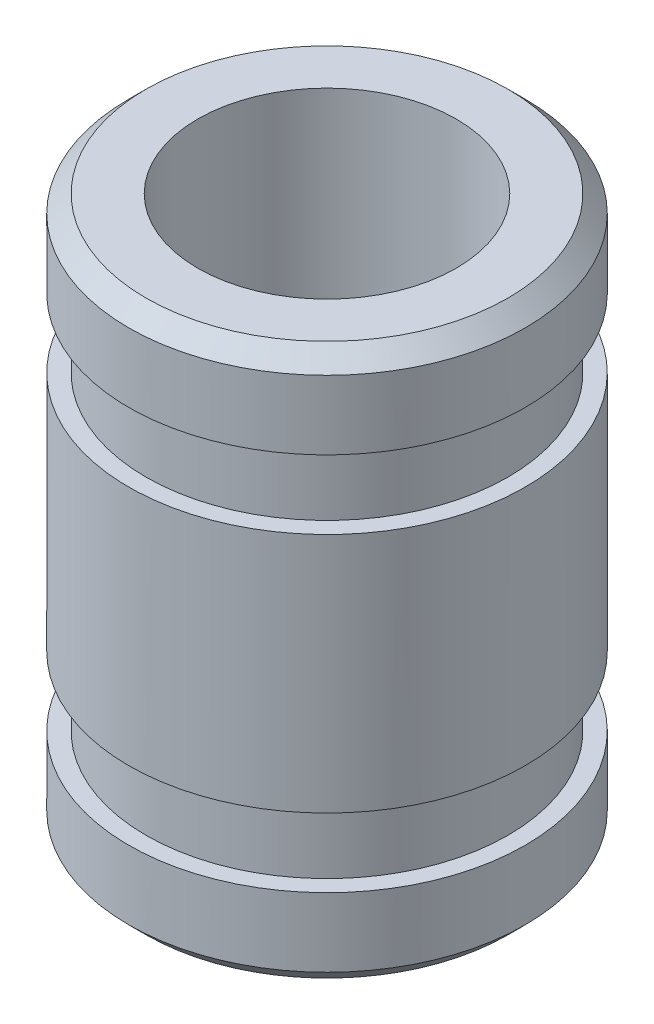
ISO-10303-21;
HEADER;
FILE_DESCRIPTION(('STEP AP214'),'2;1');
FILE_NAME('part.step','',(''),(''),'','','');
FILE_SCHEMA(('AUTOMOTIVE_DESIGN { 1 0 10303 214 1 1 1 1 }'));
ENDSEC;
DATA;
#1=APPLICATION_CONTEXT('core data for automotive mechanical design processes');
#2=APPLICATION_PROTOCOL_DEFINITION('international standard','automotive_design',2000,#1);
#3=PRODUCT_CONTEXT('',#1,'mechanical');
#4=PRODUCT('Part','Part','',(#3));
#5=PRODUCT_RELATED_PRODUCT_CATEGORY('part','',(#4));
#6=PRODUCT_DEFINITION_FORMATION('','',#4);
#7=PRODUCT_DEFINITION_CONTEXT('part definition',#1,'design');
#8=PRODUCT_DEFINITION('design','',#6,#7);
#9=PRODUCT_DEFINITION_SHAPE('','',#8);
#10=(LENGTH_UNIT() NAMED_UNIT(*) SI_UNIT(.MILLI.,.METRE.));
#11=(NAMED_UNIT(*) PLANE_ANGLE_UNIT() SI_UNIT($,.RADIAN.));
#12=(NAMED_UNIT(*) SI_UNIT($,.STERADIAN.) SOLID_ANGLE_UNIT());
#13=UNCERTAINTY_MEASURE_WITH_UNIT(LENGTH_MEASURE(1.E-05),#10,'distance_accuracy_value','');
#14=(GEOMETRIC_REPRESENTATION_CONTEXT(3) GLOBAL_UNCERTAINTY_ASSIGNED_CONTEXT((#13)) GLOBAL_UNIT_ASSIGNED_CONTEXT((#10,
#11,#12)) REPRESENTATION_CONTEXT('',''));
#15=CARTESIAN_POINT('',(0.,0.,0.));
#16=DIRECTION('',(0.,0.,1.));
#17=DIRECTION('',(1.,0.,0.));
#18=AXIS2_PLACEMENT_3D('',#15,#16,#17);
#19=CARTESIAN_POINT('',(0.,32.,0.));
#20=DIRECTION('',(0.,-1.,0.));
#21=DIRECTION('',(0.,0.,-1.));
#22=AXIS2_PLACEMENT_3D('',#19,#20,#21);
#23=CYLINDRICAL_SURFACE('',#22,11.5);
#24=CARTESIAN_POINT('',(0.,9.,0.));
#25=DIRECTION('',(0.,-1.,0.));
#26=DIRECTION('',(1.,0.,0.));
#27=AXIS2_PLACEMENT_3D('',#24,#25,#26);
#28=CIRCLE('',#27,11.5);
#29=CARTESIAN_POINT('',(11.5,9.,0.));
#30=VERTEX_POINT('',#29);
#31=EDGE_CURVE('E107',#30,#30,#28,.T.);
#32=ORIENTED_EDGE('',*,*,#31,.F.);
#33=EDGE_LOOP('',(#32));
#34=FACE_BOUND('',#33,.T.);
#35=CARTESIAN_POINT('',(0.,23.,0.));
#36=DIRECTION('',(0.,1.,0.));
#37=DIRECTION('',(0.,0.,-1.));
#38=AXIS2_PLACEMENT_3D('',#35,#36,#37);
#39=CIRCLE('',#38,11.5);
#40=CARTESIAN_POINT('',(0.,23.,-11.5000000000001));
#41=VERTEX_POINT('',#40);
#42=EDGE_CURVE('E49',#41,#41,#39,.T.);
#43=ORIENTED_EDGE('',*,*,#42,.F.);
#44=EDGE_LOOP('',(#43));
#45=FACE_BOUND('',#44,.T.);
#46=ADVANCED_FACE('F34',(#34,#45),#23,.T.);
#47=CARTESIAN_POINT('',(0.,31.,0.));
#48=DIRECTION('',(0.,1.,0.));
#49=DIRECTION('',(0.,0.,1.));
#50=AXIS2_PLACEMENT_3D('',#47,#48,#49);
#51=CIRCLE('',#50,11.5);
#52=CARTESIAN_POINT('',(0.,31.,11.5));
#53=VERTEX_POINT('',#52);
#54=EDGE_CURVE('E11',#53,#53,#51,.F.);
#55=ORIENTED_EDGE('',*,*,#54,.T.);
#56=EDGE_LOOP('',(#55));
#57=FACE_BOUND('',#56,.T.);
#58=CARTESIAN_POINT('',(0.,27.,0.));
#59=DIRECTION('',(0.,1.,0.));
#60=DIRECTION('',(0.,0.,-1.));
#61=AXIS2_PLACEMENT_3D('',#58,#59,#60);
#62=CIRCLE('',#61,11.5);
#63=CARTESIAN_POINT('',(0.,27.,-11.5000000000001));
#64=VERTEX_POINT('',#63);
#65=EDGE_CURVE('E91',#64,#64,#62,.T.);
#66=ORIENTED_EDGE('',*,*,#65,.T.);
#67=EDGE_LOOP('',(#66));
#68=FACE_BOUND('',#67,.T.);
#69=ADVANCED_FACE('F138',(#57,#68),#23,.T.);
#70=CARTESIAN_POINT('',(0.,1.,0.));
#71=DIRECTION('',(0.,1.,0.));
#72=DIRECTION('',(0.,0.,1.));
#73=AXIS2_PLACEMENT_3D('',#70,#71,#72);
#74=CIRCLE('',#73,11.5);
#75=CARTESIAN_POINT('',(0.,1.,11.5));
#76=VERTEX_POINT('',#75);
#77=EDGE_CURVE('E116',#76,#76,#74,.T.);
#78=ORIENTED_EDGE('',*,*,#77,.T.);
#79=EDGE_LOOP('',(#78));
#80=FACE_BOUND('',#79,.T.);
#81=CARTESIAN_POINT('',(0.,5.,0.));
#82=DIRECTION('',(0.,-1.,0.));
#83=DIRECTION('',(1.,0.,0.));
#84=AXIS2_PLACEMENT_3D('',#81,#82,#83);
#85=CIRCLE('',#84,11.5);
#86=CARTESIAN_POINT('',(11.5,5.,0.));
#87=VERTEX_POINT('',#86);
#88=EDGE_CURVE('E100',#87,#87,#85,.T.);
#89=ORIENTED_EDGE('',*,*,#88,.T.);
#90=EDGE_LOOP('',(#89));
#91=FACE_BOUND('',#90,.T.);
#92=ADVANCED_FACE('F141',(#80,#91),#23,.T.);
#93=CARTESIAN_POINT('',(0.,32.,0.));
#94=DIRECTION('',(0.,1.,0.));
#95=DIRECTION('',(0.,0.,1.));
#96=AXIS2_PLACEMENT_3D('',#93,#94,#95);
#97=PLANE('',#96);
#98=CARTESIAN_POINT('',(0.,32.,0.));
#99=DIRECTION('',(0.,1.,0.));
#100=DIRECTION('',(0.,0.,1.));
#101=AXIS2_PLACEMENT_3D('',#98,#99,#100);
#102=CIRCLE('',#101,10.5);
#103=CARTESIAN_POINT('',(0.,32.,10.5));
#104=VERTEX_POINT('',#103);
#105=EDGE_CURVE('E42',#104,#104,#102,.T.);
#106=ORIENTED_EDGE('',*,*,#105,.T.);
#107=EDGE_LOOP('',(#106));
#108=FACE_BOUND('',#107,.T.);
#109=CARTESIAN_POINT('',(0.,32.,0.));
#110=DIRECTION('',(0.,1.,0.));
#111=DIRECTION('',(0.,0.,1.));
#112=AXIS2_PLACEMENT_3D('',#109,#110,#111);
#113=CIRCLE('',#112,7.5);
#114=CARTESIAN_POINT('',(0.,32.,7.50000000000002));
#115=VERTEX_POINT('',#114);
#116=EDGE_CURVE('E110',#115,#115,#113,.T.);
#117=ORIENTED_EDGE('',*,*,#116,.F.);
#118=EDGE_LOOP('',(#117));
#119=FACE_BOUND('',#118,.T.);
#120=ADVANCED_FACE('F126',(#108,#119),#97,.T.);
#121=CARTESIAN_POINT('',(0.,0.,0.));
#122=DIRECTION('',(0.,1.,0.));
#123=DIRECTION('',(0.,0.,1.));
#124=AXIS2_PLACEMENT_3D('',#121,#122,#123);
#125=PLANE('',#124);
#126=CARTESIAN_POINT('',(0.,0.,0.));
#127=DIRECTION('',(0.,1.,0.));
#128=DIRECTION('',(0.,0.,1.));
#129=AXIS2_PLACEMENT_3D('',#126,#127,#128);
#130=CIRCLE('',#129,10.5);
#131=CARTESIAN_POINT('',(0.,0.,10.5));
#132=VERTEX_POINT('',#131);
#133=EDGE_CURVE('E121',#132,#132,#130,.F.);
#134=ORIENTED_EDGE('',*,*,#133,.T.);
#135=EDGE_LOOP('',(#134));
#136=FACE_BOUND('',#135,.T.);
#137=CARTESIAN_POINT('',(0.,0.,0.));
#138=DIRECTION('',(0.,1.,0.));
#139=DIRECTION('',(0.,0.,1.));
#140=AXIS2_PLACEMENT_3D('',#137,#138,#139);
#141=CIRCLE('',#140,7.5);
#142=CARTESIAN_POINT('',(0.,0.,7.50000000000002));
#143=VERTEX_POINT('',#142);
#144=EDGE_CURVE('E113',#143,#143,#141,.T.);
#145=ORIENTED_EDGE('',*,*,#144,.T.);
#146=EDGE_LOOP('',(#145));
#147=FACE_BOUND('',#146,.T.);
#148=ADVANCED_FACE('F154',(#136,#147),#125,.F.);
#149=CARTESIAN_POINT('',(0.,0.,0.));
#150=DIRECTION('',(0.,1.,0.));
#151=DIRECTION('',(0.,0.,1.));
#152=AXIS2_PLACEMENT_3D('',#149,#150,#151);
#153=CYLINDRICAL_SURFACE('',#152,7.5);
#154=ORIENTED_EDGE('',*,*,#144,.F.);
#155=EDGE_LOOP('',(#154));
#156=FACE_BOUND('',#155,.T.);
#157=ORIENTED_EDGE('',*,*,#116,.T.);
#158=EDGE_LOOP('',(#157));
#159=FACE_BOUND('',#158,.T.);
#160=ADVANCED_FACE('F170',(#156,#159),#153,.F.);
#161=CARTESIAN_POINT('',(11.5,9.,0.));
#162=DIRECTION('',(0.,1.,0.));
#163=DIRECTION('',(0.,0.,1.));
#164=AXIS2_PLACEMENT_3D('',#161,#162,#163);
#165=PLANE('',#164);
#166=ORIENTED_EDGE('',*,*,#31,.T.);
#167=EDGE_LOOP('',(#166));
#168=FACE_BOUND('',#167,.T.);
#169=CARTESIAN_POINT('',(0.,9.,0.));
#170=DIRECTION('',(0.,-1.,0.));
#171=DIRECTION('',(1.,0.,0.));
#172=AXIS2_PLACEMENT_3D('',#169,#170,#171);
#173=CIRCLE('',#172,10.5);
#174=CARTESIAN_POINT('',(10.5,9.,0.));
#175=VERTEX_POINT('',#174);
#176=EDGE_CURVE('E101',#175,#175,#173,.T.);
#177=ORIENTED_EDGE('',*,*,#176,.F.);
#178=EDGE_LOOP('',(#177));
#179=FACE_BOUND('',#178,.T.);
#180=ADVANCED_FACE('F168',(#168,#179),#165,.F.);
#181=CARTESIAN_POINT('',(11.5,5.,0.));
#182=DIRECTION('',(0.,-1.,0.));
#183=DIRECTION('',(0.,0.,-1.));
#184=AXIS2_PLACEMENT_3D('',#181,#182,#183);
#185=PLANE('',#184);
#186=CARTESIAN_POINT('',(0.,5.,0.));
#187=DIRECTION('',(0.,-1.,0.));
#188=DIRECTION('',(1.,0.,0.));
#189=AXIS2_PLACEMENT_3D('',#186,#187,#188);
#190=CIRCLE('',#189,10.5);
#191=CARTESIAN_POINT('',(10.5,5.,0.));
#192=VERTEX_POINT('',#191);
#193=EDGE_CURVE('E98',#192,#192,#190,.T.);
#194=ORIENTED_EDGE('',*,*,#193,.T.);
#195=EDGE_LOOP('',(#194));
#196=FACE_BOUND('',#195,.T.);
#197=ORIENTED_EDGE('',*,*,#88,.F.);
#198=EDGE_LOOP('',(#197));
#199=FACE_BOUND('',#198,.T.);
#200=ADVANCED_FACE('F161',(#196,#199),#185,.F.);
#201=CARTESIAN_POINT('',(0.,7.,0.));
#202=DIRECTION('',(0.,-1.,0.));
#203=DIRECTION('',(0.,0.,-1.));
#204=AXIS2_PLACEMENT_3D('',#201,#202,#203);
#205=CYLINDRICAL_SURFACE('',#204,10.5);
#206=DIRECTION('',(0.,-1.,0.));
#207=VECTOR('',#206,1.);
#208=CARTESIAN_POINT('',(10.5,9.,0.));
#209=LINE('',#208,#207);
#210=EDGE_CURVE('E93',#175,#192,#209,.T.);
#211=ORIENTED_EDGE('',*,*,#210,.T.);
#212=ORIENTED_EDGE('',*,*,#193,.F.);
#213=ORIENTED_EDGE('',*,*,#210,.F.);
#214=ORIENTED_EDGE('',*,*,#176,.T.);
#215=EDGE_LOOP('',(#211,#212,#213,#214));
#216=FACE_BOUND('',#215,.T.);
#217=ADVANCED_FACE('F165',(#216),#205,.T.);
#218=CARTESIAN_POINT('',(0.,25.,0.));
#219=DIRECTION('',(0.,1.,0.));
#220=DIRECTION('',(0.,0.,1.));
#221=AXIS2_PLACEMENT_3D('',#218,#219,#220);
#222=CYLINDRICAL_SURFACE('',#221,10.5);
#223=DIRECTION('',(0.,-1.,0.));
#224=VECTOR('',#223,1.);
#225=CARTESIAN_POINT('',(0.,27.,-10.5000000000001));
#226=LINE('',#225,#224);
#227=CARTESIAN_POINT('',(0.,27.,-10.5000000000001));
#228=VERTEX_POINT('',#227);
#229=CARTESIAN_POINT('',(0.,23.,-10.5000000000001));
#230=VERTEX_POINT('',#229);
#231=EDGE_CURVE('E77',#228,#230,#226,.T.);
#232=ORIENTED_EDGE('',*,*,#231,.F.);
#233=CARTESIAN_POINT('',(0.,27.,0.));
#234=DIRECTION('',(0.,1.,0.));
#235=DIRECTION('',(0.,0.,-1.));
#236=AXIS2_PLACEMENT_3D('',#233,#234,#235);
#237=CIRCLE('',#236,10.5);
#238=EDGE_CURVE('E79',#228,#228,#237,.T.);
#239=ORIENTED_EDGE('',*,*,#238,.F.);
#240=ORIENTED_EDGE('',*,*,#231,.T.);
#241=CARTESIAN_POINT('',(0.,23.,0.));
#242=DIRECTION('',(0.,1.,0.));
#243=DIRECTION('',(0.,0.,-1.));
#244=AXIS2_PLACEMENT_3D('',#241,#242,#243);
#245=CIRCLE('',#244,10.5);
#246=EDGE_CURVE('E81',#230,#230,#245,.T.);
#247=ORIENTED_EDGE('',*,*,#246,.T.);
#248=EDGE_LOOP('',(#232,#239,#240,#247));
#249=FACE_BOUND('',#248,.T.);
#250=ADVANCED_FACE('F78',(#249),#222,.T.);
#251=CARTESIAN_POINT('',(0.,23.,-11.5000000000001));
#252=DIRECTION('',(0.,1.,0.));
#253=DIRECTION('',(0.,0.,1.));
#254=AXIS2_PLACEMENT_3D('',#251,#252,#253);
#255=PLANE('',#254);
#256=ORIENTED_EDGE('',*,*,#42,.T.);
#257=EDGE_LOOP('',(#256));
#258=FACE_BOUND('',#257,.T.);
#259=ORIENTED_EDGE('',*,*,#246,.F.);
#260=EDGE_LOOP('',(#259));
#261=FACE_BOUND('',#260,.T.);
#262=ADVANCED_FACE('F223',(#258,#261),#255,.T.);
#263=CARTESIAN_POINT('',(0.,27.,-11.5000000000001));
#264=DIRECTION('',(0.,-1.,0.));
#265=DIRECTION('',(0.,0.,-1.));
#266=AXIS2_PLACEMENT_3D('',#263,#264,#265);
#267=PLANE('',#266);
#268=ORIENTED_EDGE('',*,*,#238,.T.);
#269=EDGE_LOOP('',(#268));
#270=FACE_BOUND('',#269,.T.);
#271=ORIENTED_EDGE('',*,*,#65,.F.);
#272=EDGE_LOOP('',(#271));
#273=FACE_BOUND('',#272,.T.);
#274=ADVANCED_FACE('F84',(#270,#273),#267,.T.);
#275=CARTESIAN_POINT('',(0.,1.,0.));
#276=DIRECTION('',(0.,1.,0.));
#277=DIRECTION('',(0.,0.,1.));
#278=AXIS2_PLACEMENT_3D('',#275,#276,#277);
#279=CONICAL_SURFACE('',#278,11.5,0.785398163397448);
#280=ORIENTED_EDGE('',*,*,#133,.F.);
#281=EDGE_LOOP('',(#280));
#282=FACE_BOUND('',#281,.T.);
#283=ORIENTED_EDGE('',*,*,#77,.F.);
#284=EDGE_LOOP('',(#283));
#285=FACE_BOUND('',#284,.T.);
#286=ADVANCED_FACE('F130',(#282,#285),#279,.T.);
#287=CARTESIAN_POINT('',(0.,32.,0.));
#288=DIRECTION('',(0.,-1.,0.));
#289=DIRECTION('',(0.,0.,-1.));
#290=AXIS2_PLACEMENT_3D('',#287,#288,#289);
#291=CONICAL_SURFACE('',#290,10.5,0.78539816339745);
#292=ORIENTED_EDGE('',*,*,#54,.F.);
#293=EDGE_LOOP('',(#292));
#294=FACE_BOUND('',#293,.T.);
#295=ORIENTED_EDGE('',*,*,#105,.F.);
#296=EDGE_LOOP('',(#295));
#297=FACE_BOUND('',#296,.T.);
#298=ADVANCED_FACE('F36',(#294,#297),#291,.T.);
#299=CLOSED_SHELL('',(#46,#69,#92,#120,#148,#160,#180,#200,#217,#250,#262,#274,#286,#298));
#300=MANIFOLD_SOLID_BREP('B2',#299);
#301=ADVANCED_BREP_SHAPE_REPRESENTATION('',(#18,#300),#14);
#302=SHAPE_DEFINITION_REPRESENTATION(#9,#301);
ENDSEC;
END-ISO-10303-21;
